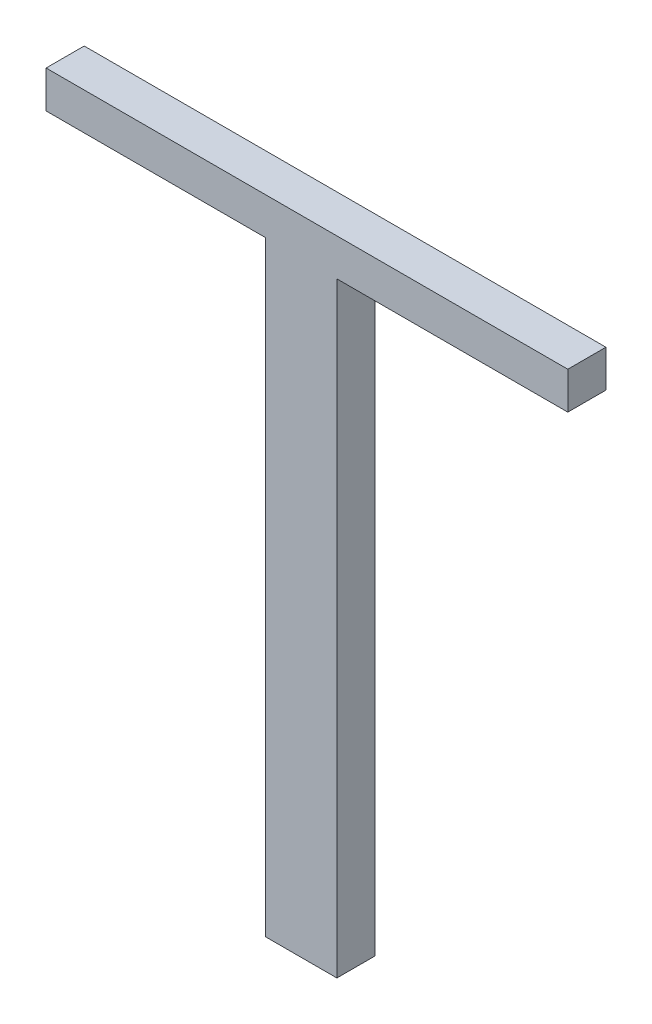
ISO-10303-21;
HEADER;
FILE_DESCRIPTION(('STEP AP214'),'2;1');
FILE_NAME('part.step','',(''),(''),'','','');
FILE_SCHEMA(('AUTOMOTIVE_DESIGN { 1 0 10303 214 1 1 1 1 }'));
ENDSEC;
DATA;
#1=APPLICATION_CONTEXT('core data for automotive mechanical design processes');
#2=APPLICATION_PROTOCOL_DEFINITION('international standard','automotive_design',2000,#1);
#3=PRODUCT_CONTEXT('',#1,'mechanical');
#4=PRODUCT('Part','Part','',(#3));
#5=PRODUCT_RELATED_PRODUCT_CATEGORY('part','',(#4));
#6=PRODUCT_DEFINITION_FORMATION('','',#4);
#7=PRODUCT_DEFINITION_CONTEXT('part definition',#1,'design');
#8=PRODUCT_DEFINITION('design','',#6,#7);
#9=PRODUCT_DEFINITION_SHAPE('','',#8);
#10=(LENGTH_UNIT() NAMED_UNIT(*) SI_UNIT(.MILLI.,.METRE.));
#11=(NAMED_UNIT(*) PLANE_ANGLE_UNIT() SI_UNIT($,.RADIAN.));
#12=(NAMED_UNIT(*) SI_UNIT($,.STERADIAN.) SOLID_ANGLE_UNIT());
#13=UNCERTAINTY_MEASURE_WITH_UNIT(LENGTH_MEASURE(1.E-05),#10,'distance_accuracy_value','');
#14=(GEOMETRIC_REPRESENTATION_CONTEXT(3) GLOBAL_UNCERTAINTY_ASSIGNED_CONTEXT((#13)) GLOBAL_UNIT_ASSIGNED_CONTEXT((#10,
#11,#12)) REPRESENTATION_CONTEXT('',''));
#15=CARTESIAN_POINT('',(0.,0.,0.));
#16=DIRECTION('',(0.,0.,1.));
#17=DIRECTION('',(1.,0.,0.));
#18=AXIS2_PLACEMENT_3D('',#15,#16,#17);
#19=CARTESIAN_POINT('',(-44.3464166534245,9.49474592782734,30.));
#20=DIRECTION('',(1.,0.,0.));
#21=DIRECTION('',(0.,0.,-1.));
#22=AXIS2_PLACEMENT_3D('',#19,#20,#21);
#23=PLANE('',#22);
#24=DIRECTION('',(0.,-1.,0.));
#25=VECTOR('',#24,1.);
#26=CARTESIAN_POINT('',(-44.3464166534245,9.49474592782734,0.));
#27=LINE('',#26,#25);
#28=CARTESIAN_POINT('',(-44.3464166534245,38.7706976005085,0.));
#29=VERTEX_POINT('',#28);
#30=CARTESIAN_POINT('',(-44.3464166534245,9.49474592782734,0.));
#31=VERTEX_POINT('',#30);
#32=EDGE_CURVE('E131',#29,#31,#27,.T.);
#33=ORIENTED_EDGE('',*,*,#32,.T.);
#34=DIRECTION('',(0.,0.,-1.));
#35=VECTOR('',#34,1.);
#36=CARTESIAN_POINT('',(-44.3464166534245,9.49474592782734,30.));
#37=LINE('',#36,#35);
#38=CARTESIAN_POINT('',(-44.3464166534245,9.49474592782734,30.));
#39=VERTEX_POINT('',#38);
#40=EDGE_CURVE('E11',#39,#31,#37,.T.);
#41=ORIENTED_EDGE('',*,*,#40,.F.);
#42=DIRECTION('',(0.,-1.,0.));
#43=VECTOR('',#42,1.);
#44=CARTESIAN_POINT('',(-44.3464166534245,9.49474592782734,30.));
#45=LINE('',#44,#43);
#46=CARTESIAN_POINT('',(-44.3464166534245,38.7706976005085,30.));
#47=VERTEX_POINT('',#46);
#48=EDGE_CURVE('E145',#47,#39,#45,.T.);
#49=ORIENTED_EDGE('',*,*,#48,.F.);
#50=DIRECTION('',(0.,0.,-1.));
#51=VECTOR('',#50,1.);
#52=CARTESIAN_POINT('',(-44.3464166534245,38.7706976005085,30.));
#53=LINE('',#52,#51);
#54=EDGE_CURVE('E127',#47,#29,#53,.T.);
#55=ORIENTED_EDGE('',*,*,#54,.T.);
#56=EDGE_LOOP('',(#33,#41,#49,#55));
#57=FACE_BOUND('',#56,.T.);
#58=ADVANCED_FACE('F35',(#57),#23,.F.);
#59=CARTESIAN_POINT('',(128.286382872945,9.49474592782734,30.));
#60=DIRECTION('',(0.,1.,0.));
#61=DIRECTION('',(0.,0.,1.));
#62=AXIS2_PLACEMENT_3D('',#59,#60,#61);
#63=PLANE('',#62);
#64=DIRECTION('',(1.,0.,0.));
#65=VECTOR('',#64,1.);
#66=CARTESIAN_POINT('',(128.286382872945,9.49474592782734,0.));
#67=LINE('',#66,#65);
#68=CARTESIAN_POINT('',(128.286382872945,9.49474592782734,0.));
#69=VERTEX_POINT('',#68);
#70=EDGE_CURVE('E134',#31,#69,#67,.T.);
#71=ORIENTED_EDGE('',*,*,#70,.T.);
#72=DIRECTION('',(0.,0.,-1.));
#73=VECTOR('',#72,1.);
#74=CARTESIAN_POINT('',(128.286382872945,9.49474592782734,30.));
#75=LINE('',#74,#73);
#76=CARTESIAN_POINT('',(128.286382872945,9.49474592782734,30.));
#77=VERTEX_POINT('',#76);
#78=EDGE_CURVE('E43',#77,#69,#75,.T.);
#79=ORIENTED_EDGE('',*,*,#78,.F.);
#80=DIRECTION('',(1.,0.,0.));
#81=VECTOR('',#80,1.);
#82=CARTESIAN_POINT('',(128.286382872945,9.49474592782734,30.));
#83=LINE('',#82,#81);
#84=EDGE_CURVE('E94',#39,#77,#83,.T.);
#85=ORIENTED_EDGE('',*,*,#84,.F.);
#86=ORIENTED_EDGE('',*,*,#40,.T.);
#87=EDGE_LOOP('',(#71,#79,#85,#86));
#88=FACE_BOUND('',#87,.T.);
#89=ADVANCED_FACE('F180',(#88),#63,.F.);
#90=CARTESIAN_POINT('',(128.286382872945,-467.187502005191,30.));
#91=DIRECTION('',(1.,0.,0.));
#92=DIRECTION('',(0.,0.,-1.));
#93=AXIS2_PLACEMENT_3D('',#90,#91,#92);
#94=PLANE('',#93);
#95=DIRECTION('',(0.,-1.,0.));
#96=VECTOR('',#95,1.);
#97=CARTESIAN_POINT('',(128.286382872945,-467.187502005191,0.));
#98=LINE('',#97,#96);
#99=CARTESIAN_POINT('',(128.286382872945,-467.187502005191,0.));
#100=VERTEX_POINT('',#99);
#101=EDGE_CURVE('E136',#69,#100,#98,.T.);
#102=ORIENTED_EDGE('',*,*,#101,.T.);
#103=DIRECTION('',(0.,0.,-1.));
#104=VECTOR('',#103,1.);
#105=CARTESIAN_POINT('',(128.286382872945,-467.187502005191,30.));
#106=LINE('',#105,#104);
#107=CARTESIAN_POINT('',(128.286382872945,-467.187502005191,30.));
#108=VERTEX_POINT('',#107);
#109=EDGE_CURVE('E152',#108,#100,#106,.T.);
#110=ORIENTED_EDGE('',*,*,#109,.F.);
#111=DIRECTION('',(0.,-1.,0.));
#112=VECTOR('',#111,1.);
#113=CARTESIAN_POINT('',(128.286382872945,-467.187502005191,30.));
#114=LINE('',#113,#112);
#115=EDGE_CURVE('E160',#77,#108,#114,.T.);
#116=ORIENTED_EDGE('',*,*,#115,.F.);
#117=ORIENTED_EDGE('',*,*,#78,.T.);
#118=EDGE_LOOP('',(#102,#110,#116,#117));
#119=FACE_BOUND('',#118,.T.);
#120=ADVANCED_FACE('F158',(#119),#94,.F.);
#121=CARTESIAN_POINT('',(184.578786153758,-467.187502005191,30.));
#122=DIRECTION('',(0.,1.,0.));
#123=DIRECTION('',(0.,0.,1.));
#124=AXIS2_PLACEMENT_3D('',#121,#122,#123);
#125=PLANE('',#124);
#126=DIRECTION('',(1.,0.,0.));
#127=VECTOR('',#126,1.);
#128=CARTESIAN_POINT('',(184.578786153758,-467.187502005191,0.));
#129=LINE('',#128,#127);
#130=CARTESIAN_POINT('',(184.578786153758,-467.187502005191,0.));
#131=VERTEX_POINT('',#130);
#132=EDGE_CURVE('E138',#100,#131,#129,.T.);
#133=ORIENTED_EDGE('',*,*,#132,.T.);
#134=DIRECTION('',(0.,0.,-1.));
#135=VECTOR('',#134,1.);
#136=CARTESIAN_POINT('',(184.578786153758,-467.187502005191,30.));
#137=LINE('',#136,#135);
#138=CARTESIAN_POINT('',(184.578786153758,-467.187502005191,30.));
#139=VERTEX_POINT('',#138);
#140=EDGE_CURVE('E149',#139,#131,#137,.T.);
#141=ORIENTED_EDGE('',*,*,#140,.F.);
#142=DIRECTION('',(1.,0.,0.));
#143=VECTOR('',#142,1.);
#144=CARTESIAN_POINT('',(184.578786153758,-467.187502005191,30.));
#145=LINE('',#144,#143);
#146=EDGE_CURVE('E172',#108,#139,#145,.T.);
#147=ORIENTED_EDGE('',*,*,#146,.F.);
#148=ORIENTED_EDGE('',*,*,#109,.T.);
#149=EDGE_LOOP('',(#133,#141,#147,#148));
#150=FACE_BOUND('',#149,.T.);
#151=ADVANCED_FACE('F168',(#150),#125,.F.);
#152=CARTESIAN_POINT('',(184.578786153758,9.49474592782734,30.));
#153=DIRECTION('',(-1.,0.,0.));
#154=DIRECTION('',(0.,0.,1.));
#155=AXIS2_PLACEMENT_3D('',#152,#153,#154);
#156=PLANE('',#155);
#157=DIRECTION('',(0.,1.,0.));
#158=VECTOR('',#157,1.);
#159=CARTESIAN_POINT('',(184.578786153758,9.49474592782734,0.));
#160=LINE('',#159,#158);
#161=CARTESIAN_POINT('',(184.578786153758,9.49474592782734,0.));
#162=VERTEX_POINT('',#161);
#163=EDGE_CURVE('E140',#131,#162,#160,.T.);
#164=ORIENTED_EDGE('',*,*,#163,.T.);
#165=DIRECTION('',(0.,0.,-1.));
#166=VECTOR('',#165,1.);
#167=CARTESIAN_POINT('',(184.578786153758,9.49474592782734,30.));
#168=LINE('',#167,#166);
#169=CARTESIAN_POINT('',(184.578786153758,9.49474592782734,30.));
#170=VERTEX_POINT('',#169);
#171=EDGE_CURVE('E122',#170,#162,#168,.T.);
#172=ORIENTED_EDGE('',*,*,#171,.F.);
#173=DIRECTION('',(0.,1.,0.));
#174=VECTOR('',#173,1.);
#175=CARTESIAN_POINT('',(184.578786153758,9.49474592782734,30.));
#176=LINE('',#175,#174);
#177=EDGE_CURVE('E113',#139,#170,#176,.T.);
#178=ORIENTED_EDGE('',*,*,#177,.F.);
#179=ORIENTED_EDGE('',*,*,#140,.T.);
#180=EDGE_LOOP('',(#164,#172,#178,#179));
#181=FACE_BOUND('',#180,.T.);
#182=ADVANCED_FACE('F171',(#181),#156,.F.);
#183=CARTESIAN_POINT('',(366.370611575713,9.49474592782734,30.));
#184=DIRECTION('',(0.,1.,0.));
#185=DIRECTION('',(0.,0.,1.));
#186=AXIS2_PLACEMENT_3D('',#183,#184,#185);
#187=PLANE('',#186);
#188=DIRECTION('',(1.,0.,0.));
#189=VECTOR('',#188,1.);
#190=CARTESIAN_POINT('',(366.370611575713,9.49474592782734,0.));
#191=LINE('',#190,#189);
#192=CARTESIAN_POINT('',(366.370611575713,9.49474592782734,0.));
#193=VERTEX_POINT('',#192);
#194=EDGE_CURVE('E121',#162,#193,#191,.T.);
#195=ORIENTED_EDGE('',*,*,#194,.T.);
#196=DIRECTION('',(0.,0.,-1.));
#197=VECTOR('',#196,1.);
#198=CARTESIAN_POINT('',(366.370611575713,9.49474592782734,30.));
#199=LINE('',#198,#197);
#200=CARTESIAN_POINT('',(366.370611575713,9.49474592782734,30.));
#201=VERTEX_POINT('',#200);
#202=EDGE_CURVE('E118',#201,#193,#199,.T.);
#203=ORIENTED_EDGE('',*,*,#202,.F.);
#204=DIRECTION('',(1.,0.,0.));
#205=VECTOR('',#204,1.);
#206=CARTESIAN_POINT('',(366.370611575713,9.49474592782734,30.));
#207=LINE('',#206,#205);
#208=EDGE_CURVE('E107',#170,#201,#207,.T.);
#209=ORIENTED_EDGE('',*,*,#208,.F.);
#210=ORIENTED_EDGE('',*,*,#171,.T.);
#211=EDGE_LOOP('',(#195,#203,#209,#210));
#212=FACE_BOUND('',#211,.T.);
#213=ADVANCED_FACE('F119',(#212),#187,.F.);
#214=CARTESIAN_POINT('',(366.370611575713,38.7706976005085,30.));
#215=DIRECTION('',(-1.,0.,0.));
#216=DIRECTION('',(0.,0.,1.));
#217=AXIS2_PLACEMENT_3D('',#214,#215,#216);
#218=PLANE('',#217);
#219=DIRECTION('',(0.,1.,0.));
#220=VECTOR('',#219,1.);
#221=CARTESIAN_POINT('',(366.370611575713,38.7706976005085,0.));
#222=LINE('',#221,#220);
#223=CARTESIAN_POINT('',(366.370611575713,38.7706976005085,0.));
#224=VERTEX_POINT('',#223);
#225=EDGE_CURVE('E80',#193,#224,#222,.T.);
#226=ORIENTED_EDGE('',*,*,#225,.T.);
#227=DIRECTION('',(0.,0.,-1.));
#228=VECTOR('',#227,1.);
#229=CARTESIAN_POINT('',(366.370611575713,38.7706976005085,30.));
#230=LINE('',#229,#228);
#231=CARTESIAN_POINT('',(366.370611575713,38.7706976005085,30.));
#232=VERTEX_POINT('',#231);
#233=EDGE_CURVE('E123',#232,#224,#230,.T.);
#234=ORIENTED_EDGE('',*,*,#233,.F.);
#235=DIRECTION('',(0.,1.,0.));
#236=VECTOR('',#235,1.);
#237=CARTESIAN_POINT('',(366.370611575713,38.7706976005085,30.));
#238=LINE('',#237,#236);
#239=EDGE_CURVE('E111',#201,#232,#238,.T.);
#240=ORIENTED_EDGE('',*,*,#239,.F.);
#241=ORIENTED_EDGE('',*,*,#202,.T.);
#242=EDGE_LOOP('',(#226,#234,#240,#241));
#243=FACE_BOUND('',#242,.T.);
#244=ADVANCED_FACE('F125',(#243),#218,.F.);
#245=CARTESIAN_POINT('',(-44.3464166534245,38.7706976005085,30.));
#246=DIRECTION('',(0.,-1.,0.));
#247=DIRECTION('',(0.,0.,-1.));
#248=AXIS2_PLACEMENT_3D('',#245,#246,#247);
#249=PLANE('',#248);
#250=DIRECTION('',(-1.,0.,0.));
#251=VECTOR('',#250,1.);
#252=CARTESIAN_POINT('',(-44.3464166534245,38.7706976005085,0.));
#253=LINE('',#252,#251);
#254=EDGE_CURVE('E86',#224,#29,#253,.T.);
#255=ORIENTED_EDGE('',*,*,#254,.T.);
#256=ORIENTED_EDGE('',*,*,#54,.F.);
#257=DIRECTION('',(-1.,0.,0.));
#258=VECTOR('',#257,1.);
#259=CARTESIAN_POINT('',(-44.3464166534245,38.7706976005085,30.));
#260=LINE('',#259,#258);
#261=EDGE_CURVE('E51',#232,#47,#260,.T.);
#262=ORIENTED_EDGE('',*,*,#261,.F.);
#263=ORIENTED_EDGE('',*,*,#233,.T.);
#264=EDGE_LOOP('',(#255,#256,#262,#263));
#265=FACE_BOUND('',#264,.T.);
#266=ADVANCED_FACE('F196',(#265),#249,.F.);
#267=CARTESIAN_POINT('',(0.,0.,30.));
#268=DIRECTION('',(0.,0.,-1.));
#269=DIRECTION('',(-1.,0.,0.));
#270=AXIS2_PLACEMENT_3D('',#267,#268,#269);
#271=PLANE('',#270);
#272=ORIENTED_EDGE('',*,*,#48,.T.);
#273=ORIENTED_EDGE('',*,*,#84,.T.);
#274=ORIENTED_EDGE('',*,*,#115,.T.);
#275=ORIENTED_EDGE('',*,*,#146,.T.);
#276=ORIENTED_EDGE('',*,*,#177,.T.);
#277=ORIENTED_EDGE('',*,*,#208,.T.);
#278=ORIENTED_EDGE('',*,*,#239,.T.);
#279=ORIENTED_EDGE('',*,*,#261,.T.);
#280=EDGE_LOOP('',(#272,#273,#274,#275,#276,#277,#278,#279));
#281=FACE_BOUND('',#280,.T.);
#282=ADVANCED_FACE('F109',(#281),#271,.F.);
#283=CARTESIAN_POINT('',(0.,0.,0.));
#284=DIRECTION('',(0.,0.,-1.));
#285=DIRECTION('',(-1.,0.,0.));
#286=AXIS2_PLACEMENT_3D('',#283,#284,#285);
#287=PLANE('',#286);
#288=ORIENTED_EDGE('',*,*,#32,.F.);
#289=ORIENTED_EDGE('',*,*,#254,.F.);
#290=ORIENTED_EDGE('',*,*,#225,.F.);
#291=ORIENTED_EDGE('',*,*,#194,.F.);
#292=ORIENTED_EDGE('',*,*,#163,.F.);
#293=ORIENTED_EDGE('',*,*,#132,.F.);
#294=ORIENTED_EDGE('',*,*,#101,.F.);
#295=ORIENTED_EDGE('',*,*,#70,.F.);
#296=EDGE_LOOP('',(#288,#289,#290,#291,#292,#293,#294,#295));
#297=FACE_BOUND('',#296,.T.);
#298=ADVANCED_FACE('F164',(#297),#287,.T.);
#299=CLOSED_SHELL('',(#58,#89,#120,#151,#182,#213,#244,#266,#282,#298));
#300=MANIFOLD_SOLID_BREP('B2',#299);
#301=ADVANCED_BREP_SHAPE_REPRESENTATION('',(#18,#300),#14);
#302=SHAPE_DEFINITION_REPRESENTATION(#9,#301);
ENDSEC;
END-ISO-10303-21;
